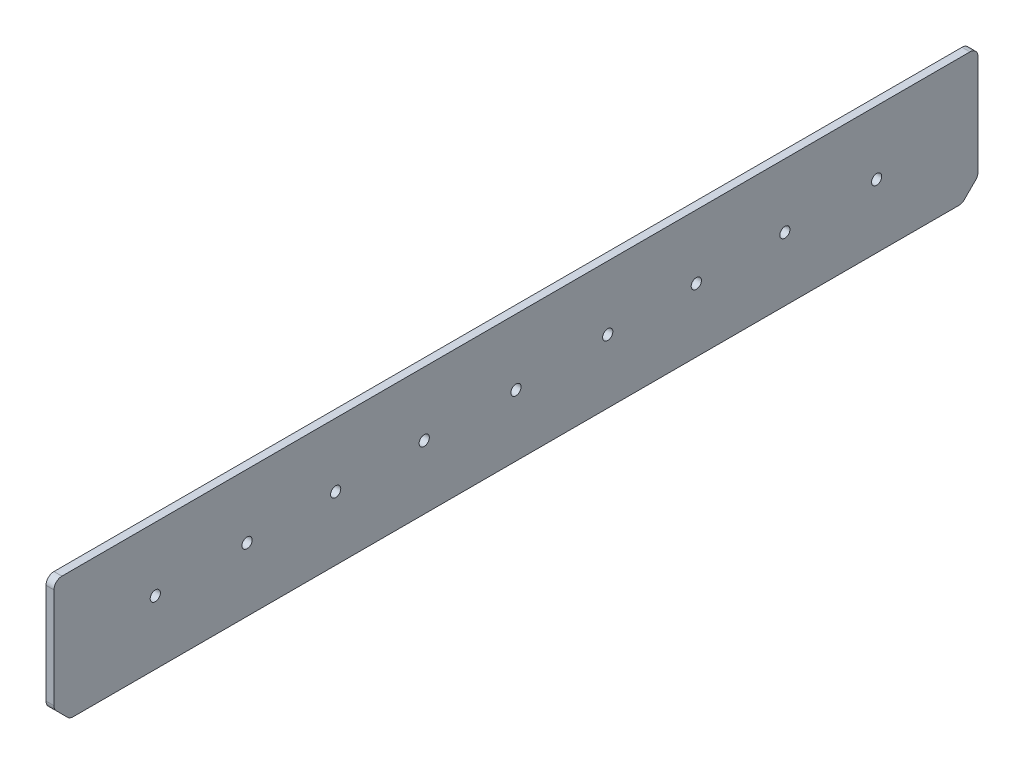
ISO-10303-21;
HEADER;
FILE_DESCRIPTION(('STEP AP214'),'2;1');
FILE_NAME('part.step','',(''),(''),'','','');
FILE_SCHEMA(('AUTOMOTIVE_DESIGN { 1 0 10303 214 1 1 1 1 }'));
ENDSEC;
DATA;
#1=APPLICATION_CONTEXT('core data for automotive mechanical design processes');
#2=APPLICATION_PROTOCOL_DEFINITION('international standard','automotive_design',2000,#1);
#3=PRODUCT_CONTEXT('',#1,'mechanical');
#4=PRODUCT('Part','Part','',(#3));
#5=PRODUCT_RELATED_PRODUCT_CATEGORY('part','',(#4));
#6=PRODUCT_DEFINITION_FORMATION('','',#4);
#7=PRODUCT_DEFINITION_CONTEXT('part definition',#1,'design');
#8=PRODUCT_DEFINITION('design','',#6,#7);
#9=PRODUCT_DEFINITION_SHAPE('','',#8);
#10=(LENGTH_UNIT() NAMED_UNIT(*) SI_UNIT(.MILLI.,.METRE.));
#11=(NAMED_UNIT(*) PLANE_ANGLE_UNIT() SI_UNIT($,.RADIAN.));
#12=(NAMED_UNIT(*) SI_UNIT($,.STERADIAN.) SOLID_ANGLE_UNIT());
#13=UNCERTAINTY_MEASURE_WITH_UNIT(LENGTH_MEASURE(1.E-05),#10,'distance_accuracy_value','');
#14=(GEOMETRIC_REPRESENTATION_CONTEXT(3) GLOBAL_UNCERTAINTY_ASSIGNED_CONTEXT((#13)) GLOBAL_UNIT_ASSIGNED_CONTEXT((#10,
#11,#12)) REPRESENTATION_CONTEXT('',''));
#15=CARTESIAN_POINT('',(0.,0.,0.));
#16=DIRECTION('',(0.,0.,1.));
#17=DIRECTION('',(1.,0.,0.));
#18=AXIS2_PLACEMENT_3D('',#15,#16,#17);
#19=CARTESIAN_POINT('',(3.175,0.,0.));
#20=DIRECTION('',(0.,0.,-1.));
#21=DIRECTION('',(-1.,0.,0.));
#22=AXIS2_PLACEMENT_3D('',#19,#20,#21);
#23=PLANE('',#22);
#24=DIRECTION('',(0.,-1.,0.));
#25=VECTOR('',#24,1.);
#26=CARTESIAN_POINT('',(0.,0.,0.));
#27=LINE('',#26,#25);
#28=CARTESIAN_POINT('',(0.,47.625,0.));
#29=VERTEX_POINT('',#28);
#30=CARTESIAN_POINT('',(0.,7.66512806053454,0.));
#31=VERTEX_POINT('',#30);
#32=EDGE_CURVE('E204',#29,#31,#27,.T.);
#33=ORIENTED_EDGE('',*,*,#32,.T.);
#34=DIRECTION('',(-1.,0.,0.));
#35=VECTOR('',#34,1.);
#36=CARTESIAN_POINT('',(3.175,7.66512806053454,0.));
#37=LINE('',#36,#35);
#38=CARTESIAN_POINT('',(3.175,7.66512806053454,0.));
#39=VERTEX_POINT('',#38);
#40=EDGE_CURVE('E11',#31,#39,#37,.F.);
#41=ORIENTED_EDGE('',*,*,#40,.T.);
#42=DIRECTION('',(0.,-1.,0.));
#43=VECTOR('',#42,1.);
#44=CARTESIAN_POINT('',(3.175,0.,0.));
#45=LINE('',#44,#43);
#46=CARTESIAN_POINT('',(3.175,47.625,0.));
#47=VERTEX_POINT('',#46);
#48=EDGE_CURVE('E155',#47,#39,#45,.T.);
#49=ORIENTED_EDGE('',*,*,#48,.F.);
#50=DIRECTION('',(-1.,0.,0.));
#51=VECTOR('',#50,1.);
#52=CARTESIAN_POINT('',(3.175,47.625,0.));
#53=LINE('',#52,#51);
#54=EDGE_CURVE('E49',#47,#29,#53,.T.);
#55=ORIENTED_EDGE('',*,*,#54,.T.);
#56=EDGE_LOOP('',(#33,#41,#49,#55));
#57=FACE_BOUND('',#56,.T.);
#58=ADVANCED_FACE('F41',(#57),#23,.F.);
#59=CARTESIAN_POINT('',(3.175,0.,0.));
#60=DIRECTION('',(0.,1.,0.));
#61=DIRECTION('',(0.,0.,1.));
#62=AXIS2_PLACEMENT_3D('',#59,#60,#61);
#63=PLANE('',#62);
#64=DIRECTION('',(0.,0.,-1.));
#65=VECTOR('',#64,1.);
#66=CARTESIAN_POINT('',(0.,0.,0.));
#67=LINE('',#66,#65);
#68=CARTESIAN_POINT('',(0.,0.,-7.66512806053454));
#69=VERTEX_POINT('',#68);
#70=CARTESIAN_POINT('',(0.,0.,-360.634871939465));
#71=VERTEX_POINT('',#70);
#72=EDGE_CURVE('E214',#69,#71,#67,.T.);
#73=ORIENTED_EDGE('',*,*,#72,.T.);
#74=DIRECTION('',(-1.,0.,0.));
#75=VECTOR('',#74,1.);
#76=CARTESIAN_POINT('',(3.175,0.,-360.634871939465));
#77=LINE('',#76,#75);
#78=CARTESIAN_POINT('',(3.175,0.,-360.634871939465));
#79=VERTEX_POINT('',#78);
#80=EDGE_CURVE('E153',#71,#79,#77,.F.);
#81=ORIENTED_EDGE('',*,*,#80,.T.);
#82=DIRECTION('',(0.,0.,-1.));
#83=VECTOR('',#82,1.);
#84=CARTESIAN_POINT('',(3.175,0.,0.));
#85=LINE('',#84,#83);
#86=CARTESIAN_POINT('',(3.175,0.,-7.66512806053454));
#87=VERTEX_POINT('',#86);
#88=EDGE_CURVE('E136',#87,#79,#85,.T.);
#89=ORIENTED_EDGE('',*,*,#88,.F.);
#90=DIRECTION('',(1.,0.,0.));
#91=VECTOR('',#90,1.);
#92=CARTESIAN_POINT('',(0.,0.,-7.66512806053454));
#93=LINE('',#92,#91);
#94=EDGE_CURVE('E150',#87,#69,#93,.F.);
#95=ORIENTED_EDGE('',*,*,#94,.T.);
#96=EDGE_LOOP('',(#73,#81,#89,#95));
#97=FACE_BOUND('',#96,.T.);
#98=ADVANCED_FACE('F149',(#97),#63,.F.);
#99=CARTESIAN_POINT('',(3.175,0.,-368.3));
#100=DIRECTION('',(0.,0.,1.));
#101=DIRECTION('',(1.,0.,0.));
#102=AXIS2_PLACEMENT_3D('',#99,#100,#101);
#103=PLANE('',#102);
#104=DIRECTION('',(0.,1.,0.));
#105=VECTOR('',#104,1.);
#106=CARTESIAN_POINT('',(3.175,0.,-368.3));
#107=LINE('',#106,#105);
#108=CARTESIAN_POINT('',(3.175,7.66512806053458,-368.3));
#109=VERTEX_POINT('',#108);
#110=CARTESIAN_POINT('',(3.175,47.625,-368.3));
#111=VERTEX_POINT('',#110);
#112=EDGE_CURVE('E154',#109,#111,#107,.T.);
#113=ORIENTED_EDGE('',*,*,#112,.F.);
#114=DIRECTION('',(1.,0.,0.));
#115=VECTOR('',#114,1.);
#116=CARTESIAN_POINT('',(0.,7.66512806053458,-368.3));
#117=LINE('',#116,#115);
#118=CARTESIAN_POINT('',(0.,7.66512806053458,-368.3));
#119=VERTEX_POINT('',#118);
#120=EDGE_CURVE('E188',#109,#119,#117,.F.);
#121=ORIENTED_EDGE('',*,*,#120,.T.);
#122=DIRECTION('',(0.,1.,0.));
#123=VECTOR('',#122,1.);
#124=CARTESIAN_POINT('',(0.,0.,-368.3));
#125=LINE('',#124,#123);
#126=CARTESIAN_POINT('',(0.,47.625,-368.3));
#127=VERTEX_POINT('',#126);
#128=EDGE_CURVE('E217',#119,#127,#125,.T.);
#129=ORIENTED_EDGE('',*,*,#128,.T.);
#130=DIRECTION('',(-1.,0.,0.));
#131=VECTOR('',#130,1.);
#132=CARTESIAN_POINT('',(3.175,47.625,-368.3));
#133=LINE('',#132,#131);
#134=EDGE_CURVE('E186',#127,#111,#133,.F.);
#135=ORIENTED_EDGE('',*,*,#134,.T.);
#136=EDGE_LOOP('',(#113,#121,#129,#135));
#137=FACE_BOUND('',#136,.T.);
#138=ADVANCED_FACE('F241',(#137),#103,.F.);
#139=CARTESIAN_POINT('',(3.175,50.8,0.));
#140=DIRECTION('',(0.,-1.,0.));
#141=DIRECTION('',(0.,0.,-1.));
#142=AXIS2_PLACEMENT_3D('',#139,#140,#141);
#143=PLANE('',#142);
#144=DIRECTION('',(0.,0.,1.));
#145=VECTOR('',#144,1.);
#146=CARTESIAN_POINT('',(3.175,50.8,0.));
#147=LINE('',#146,#145);
#148=CARTESIAN_POINT('',(3.175,50.8,-365.125));
#149=VERTEX_POINT('',#148);
#150=CARTESIAN_POINT('',(3.175,50.8,-3.175));
#151=VERTEX_POINT('',#150);
#152=EDGE_CURVE('E223',#149,#151,#147,.T.);
#153=ORIENTED_EDGE('',*,*,#152,.F.);
#154=DIRECTION('',(-1.,0.,0.));
#155=VECTOR('',#154,1.);
#156=CARTESIAN_POINT('',(3.175,50.8,-365.125));
#157=LINE('',#156,#155);
#158=CARTESIAN_POINT('',(0.,50.8,-365.125));
#159=VERTEX_POINT('',#158);
#160=EDGE_CURVE('E192',#149,#159,#157,.T.);
#161=ORIENTED_EDGE('',*,*,#160,.T.);
#162=DIRECTION('',(0.,0.,1.));
#163=VECTOR('',#162,1.);
#164=CARTESIAN_POINT('',(0.,50.8,0.));
#165=LINE('',#164,#163);
#166=CARTESIAN_POINT('',(0.,50.8,-3.175));
#167=VERTEX_POINT('',#166);
#168=EDGE_CURVE('E227',#159,#167,#165,.T.);
#169=ORIENTED_EDGE('',*,*,#168,.T.);
#170=DIRECTION('',(-1.,0.,0.));
#171=VECTOR('',#170,1.);
#172=CARTESIAN_POINT('',(3.175,50.8,-3.175));
#173=LINE('',#172,#171);
#174=EDGE_CURVE('E190',#167,#151,#173,.F.);
#175=ORIENTED_EDGE('',*,*,#174,.T.);
#176=EDGE_LOOP('',(#153,#161,#169,#175));
#177=FACE_BOUND('',#176,.T.);
#178=ADVANCED_FACE('F264',(#177),#143,.F.);
#179=CARTESIAN_POINT('',(3.175,0.,0.));
#180=DIRECTION('',(-1.,0.,0.));
#181=DIRECTION('',(0.,0.,1.));
#182=AXIS2_PLACEMENT_3D('',#179,#180,#181);
#183=PLANE('',#182);
#184=CARTESIAN_POINT('',(3.175,25.4,-327.905386247003));
#185=DIRECTION('',(1.,0.,0.));
#186=DIRECTION('',(0.,0.,-1.));
#187=AXIS2_PLACEMENT_3D('',#184,#185,#186);
#188=CIRCLE('',#187,2.03199999999995);
#189=CARTESIAN_POINT('',(3.175,25.4,-329.937386247003));
#190=VERTEX_POINT('',#189);
#191=EDGE_CURVE('E220',#190,#190,#188,.T.);
#192=ORIENTED_EDGE('',*,*,#191,.F.);
#193=EDGE_LOOP('',(#192));
#194=FACE_BOUND('',#193,.T.);
#195=CARTESIAN_POINT('',(3.175,25.4,-291.329386247003));
#196=DIRECTION('',(1.,0.,0.));
#197=DIRECTION('',(0.,0.,-1.));
#198=AXIS2_PLACEMENT_3D('',#195,#196,#197);
#199=CIRCLE('',#198,2.03199999999995);
#200=CARTESIAN_POINT('',(3.175,25.4,-293.361386247003));
#201=VERTEX_POINT('',#200);
#202=EDGE_CURVE('E472',#201,#201,#199,.T.);
#203=ORIENTED_EDGE('',*,*,#202,.F.);
#204=EDGE_LOOP('',(#203));
#205=FACE_BOUND('',#204,.T.);
#206=CARTESIAN_POINT('',(3.175,25.4,-256.023386247003));
#207=DIRECTION('',(1.,0.,0.));
#208=DIRECTION('',(0.,0.,-1.));
#209=AXIS2_PLACEMENT_3D('',#206,#207,#208);
#210=CIRCLE('',#209,2.03199999999995);
#211=CARTESIAN_POINT('',(3.175,25.4,-258.055386247003));
#212=VERTEX_POINT('',#211);
#213=EDGE_CURVE('E476',#212,#212,#210,.T.);
#214=ORIENTED_EDGE('',*,*,#213,.F.);
#215=EDGE_LOOP('',(#214));
#216=FACE_BOUND('',#215,.T.);
#217=CARTESIAN_POINT('',(3.175,25.4,-220.717386247003));
#218=DIRECTION('',(1.,0.,0.));
#219=DIRECTION('',(0.,0.,-1.));
#220=AXIS2_PLACEMENT_3D('',#217,#218,#219);
#221=CIRCLE('',#220,2.03200000000001);
#222=CARTESIAN_POINT('',(3.175,25.4,-222.749386247003));
#223=VERTEX_POINT('',#222);
#224=EDGE_CURVE('E480',#223,#223,#221,.T.);
#225=ORIENTED_EDGE('',*,*,#224,.F.);
#226=EDGE_LOOP('',(#225));
#227=FACE_BOUND('',#226,.T.);
#228=CARTESIAN_POINT('',(3.175,24.60625,-184.15));
#229=DIRECTION('',(1.,0.,0.));
#230=DIRECTION('',(0.,0.,-1.));
#231=AXIS2_PLACEMENT_3D('',#228,#229,#230);
#232=CIRCLE('',#231,2.03200000000001);
#233=CARTESIAN_POINT('',(3.175,24.60625,-186.182));
#234=VERTEX_POINT('',#233);
#235=EDGE_CURVE('E484',#234,#234,#232,.T.);
#236=ORIENTED_EDGE('',*,*,#235,.F.);
#237=EDGE_LOOP('',(#236));
#238=FACE_BOUND('',#237,.T.);
#239=CARTESIAN_POINT('',(3.175,25.4,-147.582613752997));
#240=DIRECTION('',(1.,0.,0.));
#241=DIRECTION('',(0.,0.,-1.));
#242=AXIS2_PLACEMENT_3D('',#239,#240,#241);
#243=CIRCLE('',#242,2.03200000000001);
#244=CARTESIAN_POINT('',(3.175,25.4,-149.614613752997));
#245=VERTEX_POINT('',#244);
#246=EDGE_CURVE('E488',#245,#245,#243,.T.);
#247=ORIENTED_EDGE('',*,*,#246,.F.);
#248=EDGE_LOOP('',(#247));
#249=FACE_BOUND('',#248,.T.);
#250=CARTESIAN_POINT('',(3.175,25.4,-112.276613752997));
#251=DIRECTION('',(1.,0.,0.));
#252=DIRECTION('',(0.,0.,-1.));
#253=AXIS2_PLACEMENT_3D('',#250,#251,#252);
#254=CIRCLE('',#253,2.03200000000001);
#255=CARTESIAN_POINT('',(3.175,25.4,-114.308613752997));
#256=VERTEX_POINT('',#255);
#257=EDGE_CURVE('E492',#256,#256,#254,.T.);
#258=ORIENTED_EDGE('',*,*,#257,.F.);
#259=EDGE_LOOP('',(#258));
#260=FACE_BOUND('',#259,.T.);
#261=CARTESIAN_POINT('',(3.175,25.4,-76.970613752997));
#262=DIRECTION('',(1.,0.,0.));
#263=DIRECTION('',(0.,0.,-1.));
#264=AXIS2_PLACEMENT_3D('',#261,#262,#263);
#265=CIRCLE('',#264,2.03200000000001);
#266=CARTESIAN_POINT('',(3.175,25.4,-79.002613752997));
#267=VERTEX_POINT('',#266);
#268=EDGE_CURVE('E496',#267,#267,#265,.T.);
#269=ORIENTED_EDGE('',*,*,#268,.F.);
#270=EDGE_LOOP('',(#269));
#271=FACE_BOUND('',#270,.T.);
#272=CARTESIAN_POINT('',(3.175,25.4,-40.394613752997));
#273=DIRECTION('',(1.,0.,0.));
#274=DIRECTION('',(0.,0.,-1.));
#275=AXIS2_PLACEMENT_3D('',#272,#273,#274);
#276=CIRCLE('',#275,2.032);
#277=CARTESIAN_POINT('',(3.175,25.4,-42.426613752997));
#278=VERTEX_POINT('',#277);
#279=EDGE_CURVE('E499',#278,#278,#276,.T.);
#280=ORIENTED_EDGE('',*,*,#279,.F.);
#281=EDGE_LOOP('',(#280));
#282=FACE_BOUND('',#281,.T.);
#283=ORIENTED_EDGE('',*,*,#88,.T.);
#284=CARTESIAN_POINT('',(3.175,3.175,-360.634871939465));
#285=DIRECTION('',(-1.,0.,0.));
#286=DIRECTION('',(0.,0.,1.));
#287=AXIS2_PLACEMENT_3D('',#284,#285,#286);
#288=CIRCLE('',#287,3.175);
#289=CARTESIAN_POINT('',(3.175,0.929935969732726,-362.879935969733));
#290=VERTEX_POINT('',#289);
#291=EDGE_CURVE('E171',#79,#290,#288,.F.);
#292=ORIENTED_EDGE('',*,*,#291,.T.);
#293=DIRECTION('',(0.,-0.707106781186548,0.707106781186548));
#294=VECTOR('',#293,1.);
#295=CARTESIAN_POINT('',(3.175,6.34999999999997,-368.3));
#296=LINE('',#295,#294);
#297=CARTESIAN_POINT('',(3.175,5.42006403026729,-367.370064030267));
#298=VERTEX_POINT('',#297);
#299=EDGE_CURVE('E162',#290,#298,#296,.F.);
#300=ORIENTED_EDGE('',*,*,#299,.T.);
#301=CARTESIAN_POINT('',(3.175,7.66512806053458,-365.125));
#302=DIRECTION('',(-1.,0.,0.));
#303=DIRECTION('',(0.,0.,1.));
#304=AXIS2_PLACEMENT_3D('',#301,#302,#303);
#305=CIRCLE('',#304,3.175);
#306=EDGE_CURVE('E169',#298,#109,#305,.F.);
#307=ORIENTED_EDGE('',*,*,#306,.T.);
#308=ORIENTED_EDGE('',*,*,#112,.T.);
#309=CARTESIAN_POINT('',(3.175,47.625,-365.125));
#310=DIRECTION('',(-1.,0.,0.));
#311=DIRECTION('',(0.,0.,1.));
#312=AXIS2_PLACEMENT_3D('',#309,#310,#311);
#313=CIRCLE('',#312,3.175);
#314=EDGE_CURVE('E142',#111,#149,#313,.F.);
#315=ORIENTED_EDGE('',*,*,#314,.T.);
#316=ORIENTED_EDGE('',*,*,#152,.T.);
#317=CARTESIAN_POINT('',(3.175,47.625,-3.175));
#318=DIRECTION('',(-1.,0.,0.));
#319=DIRECTION('',(0.,0.,1.));
#320=AXIS2_PLACEMENT_3D('',#317,#318,#319);
#321=CIRCLE('',#320,3.175);
#322=EDGE_CURVE('E160',#151,#47,#321,.F.);
#323=ORIENTED_EDGE('',*,*,#322,.T.);
#324=ORIENTED_EDGE('',*,*,#48,.T.);
#325=CARTESIAN_POINT('',(3.175,7.66512806053454,-3.175));
#326=DIRECTION('',(-1.,0.,0.));
#327=DIRECTION('',(0.,0.,1.));
#328=AXIS2_PLACEMENT_3D('',#325,#326,#327);
#329=CIRCLE('',#328,3.175);
#330=CARTESIAN_POINT('',(3.175,5.42006403026726,-0.92993596973271));
#331=VERTEX_POINT('',#330);
#332=EDGE_CURVE('E143',#39,#331,#329,.F.);
#333=ORIENTED_EDGE('',*,*,#332,.T.);
#334=DIRECTION('',(0.,0.707106781186548,0.707106781186548));
#335=VECTOR('',#334,1.);
#336=CARTESIAN_POINT('',(3.175,0.,-6.34999999999997));
#337=LINE('',#336,#335);
#338=CARTESIAN_POINT('',(3.175,0.929935969732711,-5.42006403026726));
#339=VERTEX_POINT('',#338);
#340=EDGE_CURVE('E138',#331,#339,#337,.F.);
#341=ORIENTED_EDGE('',*,*,#340,.T.);
#342=CARTESIAN_POINT('',(3.175,3.175,-7.66512806053454));
#343=DIRECTION('',(-1.,0.,0.));
#344=DIRECTION('',(0.,0.,1.));
#345=AXIS2_PLACEMENT_3D('',#342,#343,#344);
#346=CIRCLE('',#345,3.175);
#347=EDGE_CURVE('E133',#339,#87,#346,.F.);
#348=ORIENTED_EDGE('',*,*,#347,.T.);
#349=EDGE_LOOP('',(#283,#292,#300,#307,#308,#315,#316,#323,#324,#333,#341,#348));
#350=FACE_BOUND('',#349,.T.);
#351=ADVANCED_FACE('F135',(#194,#205,#216,#227,#238,#249,#260,#271,#282,#350),#183,.F.);
#352=CARTESIAN_POINT('',(0.,0.,0.));
#353=DIRECTION('',(-1.,0.,0.));
#354=DIRECTION('',(0.,0.,1.));
#355=AXIS2_PLACEMENT_3D('',#352,#353,#354);
#356=PLANE('',#355);
#357=CARTESIAN_POINT('',(0.,25.4,-327.905386247003));
#358=DIRECTION('',(1.,0.,0.));
#359=DIRECTION('',(0.,0.,-1.));
#360=AXIS2_PLACEMENT_3D('',#357,#358,#359);
#361=CIRCLE('',#360,2.03199999999995);
#362=CARTESIAN_POINT('',(0.,25.4,-329.937386247003));
#363=VERTEX_POINT('',#362);
#364=EDGE_CURVE('E215',#363,#363,#361,.T.);
#365=ORIENTED_EDGE('',*,*,#364,.T.);
#366=EDGE_LOOP('',(#365));
#367=FACE_BOUND('',#366,.T.);
#368=CARTESIAN_POINT('',(0.,25.4,-291.329386247003));
#369=DIRECTION('',(1.,0.,0.));
#370=DIRECTION('',(0.,0.,-1.));
#371=AXIS2_PLACEMENT_3D('',#368,#369,#370);
#372=CIRCLE('',#371,2.03199999999995);
#373=CARTESIAN_POINT('',(0.,25.4,-293.361386247003));
#374=VERTEX_POINT('',#373);
#375=EDGE_CURVE('E527',#374,#374,#372,.T.);
#376=ORIENTED_EDGE('',*,*,#375,.T.);
#377=EDGE_LOOP('',(#376));
#378=FACE_BOUND('',#377,.T.);
#379=CARTESIAN_POINT('',(0.,25.4,-256.023386247003));
#380=DIRECTION('',(1.,0.,0.));
#381=DIRECTION('',(0.,0.,-1.));
#382=AXIS2_PLACEMENT_3D('',#379,#380,#381);
#383=CIRCLE('',#382,2.03199999999995);
#384=CARTESIAN_POINT('',(0.,25.4,-258.055386247003));
#385=VERTEX_POINT('',#384);
#386=EDGE_CURVE('E523',#385,#385,#383,.T.);
#387=ORIENTED_EDGE('',*,*,#386,.T.);
#388=EDGE_LOOP('',(#387));
#389=FACE_BOUND('',#388,.T.);
#390=CARTESIAN_POINT('',(0.,25.4,-220.717386247003));
#391=DIRECTION('',(1.,0.,0.));
#392=DIRECTION('',(0.,0.,-1.));
#393=AXIS2_PLACEMENT_3D('',#390,#391,#392);
#394=CIRCLE('',#393,2.03200000000001);
#395=CARTESIAN_POINT('',(0.,25.4,-222.749386247003));
#396=VERTEX_POINT('',#395);
#397=EDGE_CURVE('E519',#396,#396,#394,.T.);
#398=ORIENTED_EDGE('',*,*,#397,.T.);
#399=EDGE_LOOP('',(#398));
#400=FACE_BOUND('',#399,.T.);
#401=CARTESIAN_POINT('',(0.,24.60625,-184.15));
#402=DIRECTION('',(1.,0.,0.));
#403=DIRECTION('',(0.,0.,-1.));
#404=AXIS2_PLACEMENT_3D('',#401,#402,#403);
#405=CIRCLE('',#404,2.03200000000001);
#406=CARTESIAN_POINT('',(0.,24.60625,-186.182));
#407=VERTEX_POINT('',#406);
#408=EDGE_CURVE('E515',#407,#407,#405,.T.);
#409=ORIENTED_EDGE('',*,*,#408,.T.);
#410=EDGE_LOOP('',(#409));
#411=FACE_BOUND('',#410,.T.);
#412=CARTESIAN_POINT('',(0.,25.4,-147.582613752997));
#413=DIRECTION('',(1.,0.,0.));
#414=DIRECTION('',(0.,0.,-1.));
#415=AXIS2_PLACEMENT_3D('',#412,#413,#414);
#416=CIRCLE('',#415,2.03200000000001);
#417=CARTESIAN_POINT('',(0.,25.4,-149.614613752997));
#418=VERTEX_POINT('',#417);
#419=EDGE_CURVE('E511',#418,#418,#416,.T.);
#420=ORIENTED_EDGE('',*,*,#419,.T.);
#421=EDGE_LOOP('',(#420));
#422=FACE_BOUND('',#421,.T.);
#423=CARTESIAN_POINT('',(0.,25.4,-112.276613752997));
#424=DIRECTION('',(1.,0.,0.));
#425=DIRECTION('',(0.,0.,-1.));
#426=AXIS2_PLACEMENT_3D('',#423,#424,#425);
#427=CIRCLE('',#426,2.03200000000001);
#428=CARTESIAN_POINT('',(0.,25.4,-114.308613752997));
#429=VERTEX_POINT('',#428);
#430=EDGE_CURVE('E507',#429,#429,#427,.T.);
#431=ORIENTED_EDGE('',*,*,#430,.T.);
#432=EDGE_LOOP('',(#431));
#433=FACE_BOUND('',#432,.T.);
#434=CARTESIAN_POINT('',(0.,25.4,-76.970613752997));
#435=DIRECTION('',(1.,0.,0.));
#436=DIRECTION('',(0.,0.,-1.));
#437=AXIS2_PLACEMENT_3D('',#434,#435,#436);
#438=CIRCLE('',#437,2.03200000000001);
#439=CARTESIAN_POINT('',(0.,25.4,-79.002613752997));
#440=VERTEX_POINT('',#439);
#441=EDGE_CURVE('E501',#440,#440,#438,.T.);
#442=ORIENTED_EDGE('',*,*,#441,.T.);
#443=EDGE_LOOP('',(#442));
#444=FACE_BOUND('',#443,.T.);
#445=CARTESIAN_POINT('',(0.,25.4,-40.394613752997));
#446=DIRECTION('',(1.,0.,0.));
#447=DIRECTION('',(0.,0.,-1.));
#448=AXIS2_PLACEMENT_3D('',#445,#446,#447);
#449=CIRCLE('',#448,2.032);
#450=CARTESIAN_POINT('',(0.,25.4,-42.426613752997));
#451=VERTEX_POINT('',#450);
#452=EDGE_CURVE('E257',#451,#451,#449,.T.);
#453=ORIENTED_EDGE('',*,*,#452,.T.);
#454=EDGE_LOOP('',(#453));
#455=FACE_BOUND('',#454,.T.);
#456=DIRECTION('',(0.,0.707106781186548,-0.707106781186548));
#457=VECTOR('',#456,1.);
#458=CARTESIAN_POINT('',(0.,-180.975,-180.975));
#459=LINE('',#458,#457);
#460=CARTESIAN_POINT('',(0.,5.42006403026729,-367.370064030267));
#461=VERTEX_POINT('',#460);
#462=CARTESIAN_POINT('',(0.,0.929935969732759,-362.879935969733));
#463=VERTEX_POINT('',#462);
#464=EDGE_CURVE('E229',#461,#463,#459,.F.);
#465=ORIENTED_EDGE('',*,*,#464,.T.);
#466=CARTESIAN_POINT('',(0.,3.175,-360.634871939465));
#467=DIRECTION('',(-1.,0.,0.));
#468=DIRECTION('',(0.,0.,1.));
#469=AXIS2_PLACEMENT_3D('',#466,#467,#468);
#470=CIRCLE('',#469,3.175);
#471=EDGE_CURVE('E184',#463,#71,#470,.T.);
#472=ORIENTED_EDGE('',*,*,#471,.T.);
#473=ORIENTED_EDGE('',*,*,#72,.F.);
#474=CARTESIAN_POINT('',(0.,3.175,-7.66512806053454));
#475=DIRECTION('',(-1.,0.,0.));
#476=DIRECTION('',(0.,0.,1.));
#477=AXIS2_PLACEMENT_3D('',#474,#475,#476);
#478=CIRCLE('',#477,3.175);
#479=CARTESIAN_POINT('',(0.,0.92993596973271,-5.42006403026726));
#480=VERTEX_POINT('',#479);
#481=EDGE_CURVE('E158',#69,#480,#478,.T.);
#482=ORIENTED_EDGE('',*,*,#481,.T.);
#483=DIRECTION('',(0.,-0.707106781186548,-0.707106781186548));
#484=VECTOR('',#483,1.);
#485=CARTESIAN_POINT('',(0.,3.17499999999998,-3.17499999999998));
#486=LINE('',#485,#484);
#487=CARTESIAN_POINT('',(0.,5.42006403026726,-0.92993596973271));
#488=VERTEX_POINT('',#487);
#489=EDGE_CURVE('E231',#480,#488,#486,.F.);
#490=ORIENTED_EDGE('',*,*,#489,.T.);
#491=CARTESIAN_POINT('',(0.,7.66512806053454,-3.175));
#492=DIRECTION('',(-1.,0.,0.));
#493=DIRECTION('',(0.,0.,1.));
#494=AXIS2_PLACEMENT_3D('',#491,#492,#493);
#495=CIRCLE('',#494,3.175);
#496=EDGE_CURVE('E179',#488,#31,#495,.T.);
#497=ORIENTED_EDGE('',*,*,#496,.T.);
#498=ORIENTED_EDGE('',*,*,#32,.F.);
#499=CARTESIAN_POINT('',(0.,47.625,-3.175));
#500=DIRECTION('',(-1.,0.,0.));
#501=DIRECTION('',(0.,0.,1.));
#502=AXIS2_PLACEMENT_3D('',#499,#500,#501);
#503=CIRCLE('',#502,3.175);
#504=EDGE_CURVE('E177',#29,#167,#503,.T.);
#505=ORIENTED_EDGE('',*,*,#504,.T.);
#506=ORIENTED_EDGE('',*,*,#168,.F.);
#507=CARTESIAN_POINT('',(0.,47.625,-365.125));
#508=DIRECTION('',(-1.,0.,0.));
#509=DIRECTION('',(0.,0.,1.));
#510=AXIS2_PLACEMENT_3D('',#507,#508,#509);
#511=CIRCLE('',#510,3.175);
#512=EDGE_CURVE('E56',#159,#127,#511,.T.);
#513=ORIENTED_EDGE('',*,*,#512,.T.);
#514=ORIENTED_EDGE('',*,*,#128,.F.);
#515=CARTESIAN_POINT('',(0.,7.66512806053458,-365.125));
#516=DIRECTION('',(-1.,0.,0.));
#517=DIRECTION('',(0.,0.,1.));
#518=AXIS2_PLACEMENT_3D('',#515,#516,#517);
#519=CIRCLE('',#518,3.175);
#520=EDGE_CURVE('E64',#119,#461,#519,.T.);
#521=ORIENTED_EDGE('',*,*,#520,.T.);
#522=EDGE_LOOP('',(#465,#472,#473,#482,#490,#497,#498,#505,#506,#513,#514,#521));
#523=FACE_BOUND('',#522,.T.);
#524=ADVANCED_FACE('F210',(#367,#378,#389,#400,#411,#422,#433,#444,#455,#523),#356,.T.);
#525=CARTESIAN_POINT('',(0.,25.4,-40.394613752997));
#526=DIRECTION('',(1.,0.,0.));
#527=DIRECTION('',(0.,0.,-1.));
#528=AXIS2_PLACEMENT_3D('',#525,#526,#527);
#529=CYLINDRICAL_SURFACE('',#528,2.032);
#530=ORIENTED_EDGE('',*,*,#452,.F.);
#531=EDGE_LOOP('',(#530));
#532=FACE_BOUND('',#531,.T.);
#533=ORIENTED_EDGE('',*,*,#279,.T.);
#534=EDGE_LOOP('',(#533));
#535=FACE_BOUND('',#534,.T.);
#536=ADVANCED_FACE('F410',(#532,#535),#529,.F.);
#537=CARTESIAN_POINT('',(0.,25.4,-76.970613752997));
#538=DIRECTION('',(1.,0.,0.));
#539=DIRECTION('',(0.,0.,-1.));
#540=AXIS2_PLACEMENT_3D('',#537,#538,#539);
#541=CYLINDRICAL_SURFACE('',#540,2.03200000000001);
#542=ORIENTED_EDGE('',*,*,#441,.F.);
#543=EDGE_LOOP('',(#542));
#544=FACE_BOUND('',#543,.T.);
#545=ORIENTED_EDGE('',*,*,#268,.T.);
#546=EDGE_LOOP('',(#545));
#547=FACE_BOUND('',#546,.T.);
#548=ADVANCED_FACE('F401',(#544,#547),#541,.F.);
#549=CARTESIAN_POINT('',(0.,25.4,-112.276613752997));
#550=DIRECTION('',(1.,0.,0.));
#551=DIRECTION('',(0.,0.,-1.));
#552=AXIS2_PLACEMENT_3D('',#549,#550,#551);
#553=CYLINDRICAL_SURFACE('',#552,2.03200000000001);
#554=ORIENTED_EDGE('',*,*,#430,.F.);
#555=EDGE_LOOP('',(#554));
#556=FACE_BOUND('',#555,.T.);
#557=ORIENTED_EDGE('',*,*,#257,.T.);
#558=EDGE_LOOP('',(#557));
#559=FACE_BOUND('',#558,.T.);
#560=ADVANCED_FACE('F392',(#556,#559),#553,.F.);
#561=CARTESIAN_POINT('',(0.,25.4,-147.582613752997));
#562=DIRECTION('',(1.,0.,0.));
#563=DIRECTION('',(0.,0.,-1.));
#564=AXIS2_PLACEMENT_3D('',#561,#562,#563);
#565=CYLINDRICAL_SURFACE('',#564,2.03200000000001);
#566=ORIENTED_EDGE('',*,*,#419,.F.);
#567=EDGE_LOOP('',(#566));
#568=FACE_BOUND('',#567,.T.);
#569=ORIENTED_EDGE('',*,*,#246,.T.);
#570=EDGE_LOOP('',(#569));
#571=FACE_BOUND('',#570,.T.);
#572=ADVANCED_FACE('F383',(#568,#571),#565,.F.);
#573=CARTESIAN_POINT('',(0.,24.60625,-184.15));
#574=DIRECTION('',(1.,0.,0.));
#575=DIRECTION('',(0.,0.,-1.));
#576=AXIS2_PLACEMENT_3D('',#573,#574,#575);
#577=CYLINDRICAL_SURFACE('',#576,2.03200000000001);
#578=ORIENTED_EDGE('',*,*,#408,.F.);
#579=EDGE_LOOP('',(#578));
#580=FACE_BOUND('',#579,.T.);
#581=ORIENTED_EDGE('',*,*,#235,.T.);
#582=EDGE_LOOP('',(#581));
#583=FACE_BOUND('',#582,.T.);
#584=ADVANCED_FACE('F374',(#580,#583),#577,.F.);
#585=CARTESIAN_POINT('',(0.,25.4,-220.717386247003));
#586=DIRECTION('',(1.,0.,0.));
#587=DIRECTION('',(0.,0.,-1.));
#588=AXIS2_PLACEMENT_3D('',#585,#586,#587);
#589=CYLINDRICAL_SURFACE('',#588,2.03200000000001);
#590=ORIENTED_EDGE('',*,*,#397,.F.);
#591=EDGE_LOOP('',(#590));
#592=FACE_BOUND('',#591,.T.);
#593=ORIENTED_EDGE('',*,*,#224,.T.);
#594=EDGE_LOOP('',(#593));
#595=FACE_BOUND('',#594,.T.);
#596=ADVANCED_FACE('F365',(#592,#595),#589,.F.);
#597=CARTESIAN_POINT('',(0.,25.4,-256.023386247003));
#598=DIRECTION('',(1.,0.,0.));
#599=DIRECTION('',(0.,0.,-1.));
#600=AXIS2_PLACEMENT_3D('',#597,#598,#599);
#601=CYLINDRICAL_SURFACE('',#600,2.03199999999995);
#602=ORIENTED_EDGE('',*,*,#386,.F.);
#603=EDGE_LOOP('',(#602));
#604=FACE_BOUND('',#603,.T.);
#605=ORIENTED_EDGE('',*,*,#213,.T.);
#606=EDGE_LOOP('',(#605));
#607=FACE_BOUND('',#606,.T.);
#608=ADVANCED_FACE('F356',(#604,#607),#601,.F.);
#609=CARTESIAN_POINT('',(0.,25.4,-291.329386247003));
#610=DIRECTION('',(1.,0.,0.));
#611=DIRECTION('',(0.,0.,-1.));
#612=AXIS2_PLACEMENT_3D('',#609,#610,#611);
#613=CYLINDRICAL_SURFACE('',#612,2.03199999999995);
#614=ORIENTED_EDGE('',*,*,#375,.F.);
#615=EDGE_LOOP('',(#614));
#616=FACE_BOUND('',#615,.T.);
#617=ORIENTED_EDGE('',*,*,#202,.T.);
#618=EDGE_LOOP('',(#617));
#619=FACE_BOUND('',#618,.T.);
#620=ADVANCED_FACE('F347',(#616,#619),#613,.F.);
#621=CARTESIAN_POINT('',(0.,25.4,-327.905386247003));
#622=DIRECTION('',(1.,0.,0.));
#623=DIRECTION('',(0.,0.,-1.));
#624=AXIS2_PLACEMENT_3D('',#621,#622,#623);
#625=CYLINDRICAL_SURFACE('',#624,2.03199999999995);
#626=ORIENTED_EDGE('',*,*,#364,.F.);
#627=EDGE_LOOP('',(#626));
#628=FACE_BOUND('',#627,.T.);
#629=ORIENTED_EDGE('',*,*,#191,.T.);
#630=EDGE_LOOP('',(#629));
#631=FACE_BOUND('',#630,.T.);
#632=ADVANCED_FACE('F290',(#628,#631),#625,.F.);
#633=CARTESIAN_POINT('',(3.175,0.,-6.34999999999997));
#634=DIRECTION('',(0.,0.707106781186548,-0.707106781186548));
#635=DIRECTION('',(-1.,0.,0.));
#636=AXIS2_PLACEMENT_3D('',#633,#634,#635);
#637=PLANE('',#636);
#638=ORIENTED_EDGE('',*,*,#489,.F.);
#639=DIRECTION('',(-1.,0.,0.));
#640=VECTOR('',#639,1.);
#641=CARTESIAN_POINT('',(3.175,0.929935969732711,-5.42006403026726));
#642=LINE('',#641,#640);
#643=EDGE_CURVE('E197',#480,#339,#642,.F.);
#644=ORIENTED_EDGE('',*,*,#643,.T.);
#645=ORIENTED_EDGE('',*,*,#340,.F.);
#646=DIRECTION('',(1.,0.,0.));
#647=VECTOR('',#646,1.);
#648=CARTESIAN_POINT('',(0.,5.42006403026726,-0.929935969732711));
#649=LINE('',#648,#647);
#650=EDGE_CURVE('E195',#331,#488,#649,.F.);
#651=ORIENTED_EDGE('',*,*,#650,.T.);
#652=EDGE_LOOP('',(#638,#644,#645,#651));
#653=FACE_BOUND('',#652,.T.);
#654=ADVANCED_FACE('F250',(#653),#637,.F.);
#655=CARTESIAN_POINT('',(3.175,6.34999999999997,-368.3));
#656=DIRECTION('',(0.,0.707106781186548,0.707106781186548));
#657=DIRECTION('',(-1.,0.,0.));
#658=AXIS2_PLACEMENT_3D('',#655,#656,#657);
#659=PLANE('',#658);
#660=ORIENTED_EDGE('',*,*,#299,.F.);
#661=DIRECTION('',(1.,0.,0.));
#662=VECTOR('',#661,1.);
#663=CARTESIAN_POINT('',(0.,0.929935969732722,-362.879935969733));
#664=LINE('',#663,#662);
#665=EDGE_CURVE('E175',#290,#463,#664,.F.);
#666=ORIENTED_EDGE('',*,*,#665,.T.);
#667=ORIENTED_EDGE('',*,*,#464,.F.);
#668=DIRECTION('',(-1.,0.,0.));
#669=VECTOR('',#668,1.);
#670=CARTESIAN_POINT('',(3.175,5.42006403026729,-367.370064030267));
#671=LINE('',#670,#669);
#672=EDGE_CURVE('E173',#461,#298,#671,.F.);
#673=ORIENTED_EDGE('',*,*,#672,.T.);
#674=EDGE_LOOP('',(#660,#666,#667,#673));
#675=FACE_BOUND('',#674,.T.);
#676=ADVANCED_FACE('F245',(#675),#659,.F.);
#677=CARTESIAN_POINT('',(3.175,3.175,-360.634871939465));
#678=DIRECTION('',(1.,0.,0.));
#679=DIRECTION('',(0.,0.,-1.));
#680=AXIS2_PLACEMENT_3D('',#677,#678,#679);
#681=CYLINDRICAL_SURFACE('',#680,3.175);
#682=ORIENTED_EDGE('',*,*,#471,.F.);
#683=ORIENTED_EDGE('',*,*,#665,.F.);
#684=ORIENTED_EDGE('',*,*,#291,.F.);
#685=ORIENTED_EDGE('',*,*,#80,.F.);
#686=EDGE_LOOP('',(#682,#683,#684,#685));
#687=FACE_BOUND('',#686,.T.);
#688=ADVANCED_FACE('F247',(#687),#681,.T.);
#689=CARTESIAN_POINT('',(3.175,7.66512806053458,-365.125));
#690=DIRECTION('',(-1.,0.,0.));
#691=DIRECTION('',(0.,0.,1.));
#692=AXIS2_PLACEMENT_3D('',#689,#690,#691);
#693=CYLINDRICAL_SURFACE('',#692,3.175);
#694=ORIENTED_EDGE('',*,*,#306,.F.);
#695=ORIENTED_EDGE('',*,*,#672,.F.);
#696=ORIENTED_EDGE('',*,*,#520,.F.);
#697=ORIENTED_EDGE('',*,*,#120,.F.);
#698=EDGE_LOOP('',(#694,#695,#696,#697));
#699=FACE_BOUND('',#698,.T.);
#700=ADVANCED_FACE('F239',(#699),#693,.T.);
#701=CARTESIAN_POINT('',(3.175,47.625,-365.125));
#702=DIRECTION('',(-1.,0.,0.));
#703=DIRECTION('',(0.,0.,1.));
#704=AXIS2_PLACEMENT_3D('',#701,#702,#703);
#705=CYLINDRICAL_SURFACE('',#704,3.175);
#706=ORIENTED_EDGE('',*,*,#314,.F.);
#707=ORIENTED_EDGE('',*,*,#134,.F.);
#708=ORIENTED_EDGE('',*,*,#512,.F.);
#709=ORIENTED_EDGE('',*,*,#160,.F.);
#710=EDGE_LOOP('',(#706,#707,#708,#709));
#711=FACE_BOUND('',#710,.T.);
#712=ADVANCED_FACE('F266',(#711),#705,.T.);
#713=CARTESIAN_POINT('',(3.175,3.175,-7.66512806053454));
#714=DIRECTION('',(-1.,0.,0.));
#715=DIRECTION('',(0.,0.,1.));
#716=AXIS2_PLACEMENT_3D('',#713,#714,#715);
#717=CYLINDRICAL_SURFACE('',#716,3.175);
#718=ORIENTED_EDGE('',*,*,#347,.F.);
#719=ORIENTED_EDGE('',*,*,#643,.F.);
#720=ORIENTED_EDGE('',*,*,#481,.F.);
#721=ORIENTED_EDGE('',*,*,#94,.F.);
#722=EDGE_LOOP('',(#718,#719,#720,#721));
#723=FACE_BOUND('',#722,.T.);
#724=ADVANCED_FACE('F157',(#723),#717,.T.);
#725=CARTESIAN_POINT('',(3.175,7.66512806053454,-3.175));
#726=DIRECTION('',(1.,0.,0.));
#727=DIRECTION('',(0.,0.,-1.));
#728=AXIS2_PLACEMENT_3D('',#725,#726,#727);
#729=CYLINDRICAL_SURFACE('',#728,3.175);
#730=ORIENTED_EDGE('',*,*,#496,.F.);
#731=ORIENTED_EDGE('',*,*,#650,.F.);
#732=ORIENTED_EDGE('',*,*,#332,.F.);
#733=ORIENTED_EDGE('',*,*,#40,.F.);
#734=EDGE_LOOP('',(#730,#731,#732,#733));
#735=FACE_BOUND('',#734,.T.);
#736=ADVANCED_FACE('F253',(#735),#729,.T.);
#737=CARTESIAN_POINT('',(3.175,47.625,-3.175));
#738=DIRECTION('',(-1.,0.,0.));
#739=DIRECTION('',(0.,0.,1.));
#740=AXIS2_PLACEMENT_3D('',#737,#738,#739);
#741=CYLINDRICAL_SURFACE('',#740,3.175);
#742=ORIENTED_EDGE('',*,*,#322,.F.);
#743=ORIENTED_EDGE('',*,*,#174,.F.);
#744=ORIENTED_EDGE('',*,*,#504,.F.);
#745=ORIENTED_EDGE('',*,*,#54,.F.);
#746=EDGE_LOOP('',(#742,#743,#744,#745));
#747=FACE_BOUND('',#746,.T.);
#748=ADVANCED_FACE('F43',(#747),#741,.T.);
#749=CLOSED_SHELL('',(#58,#98,#138,#178,#351,#524,#536,#548,#560,#572,#584,#596,#608,#620,#632,
#654,#676,#688,#700,#712,#724,#736,#748));
#750=MANIFOLD_SOLID_BREP('B2',#749);
#751=ADVANCED_BREP_SHAPE_REPRESENTATION('',(#18,#750),#14);
#752=SHAPE_DEFINITION_REPRESENTATION(#9,#751);
ENDSEC;
END-ISO-10303-21;
